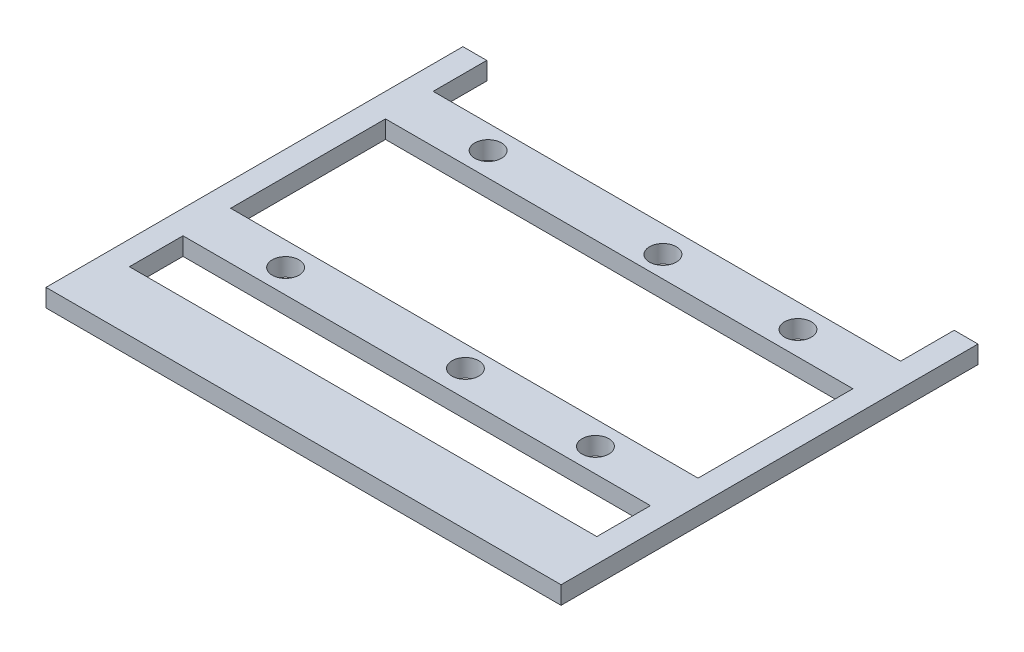
ISO-10303-21;
HEADER;
FILE_DESCRIPTION(('STEP AP214'),'2;1');
FILE_NAME('part.step','',(''),(''),'','','');
FILE_SCHEMA(('AUTOMOTIVE_DESIGN { 1 0 10303 214 1 1 1 1 }'));
ENDSEC;
DATA;
#1=APPLICATION_CONTEXT('core data for automotive mechanical design processes');
#2=APPLICATION_PROTOCOL_DEFINITION('international standard','automotive_design',2000,#1);
#3=PRODUCT_CONTEXT('',#1,'mechanical');
#4=PRODUCT('Part','Part','',(#3));
#5=PRODUCT_RELATED_PRODUCT_CATEGORY('part','',(#4));
#6=PRODUCT_DEFINITION_FORMATION('','',#4);
#7=PRODUCT_DEFINITION_CONTEXT('part definition',#1,'design');
#8=PRODUCT_DEFINITION('design','',#6,#7);
#9=PRODUCT_DEFINITION_SHAPE('','',#8);
#10=(LENGTH_UNIT() NAMED_UNIT(*) SI_UNIT(.MILLI.,.METRE.));
#11=(NAMED_UNIT(*) PLANE_ANGLE_UNIT() SI_UNIT($,.RADIAN.));
#12=(NAMED_UNIT(*) SI_UNIT($,.STERADIAN.) SOLID_ANGLE_UNIT());
#13=UNCERTAINTY_MEASURE_WITH_UNIT(LENGTH_MEASURE(1.E-05),#10,'distance_accuracy_value','');
#14=(GEOMETRIC_REPRESENTATION_CONTEXT(3) GLOBAL_UNCERTAINTY_ASSIGNED_CONTEXT((#13)) GLOBAL_UNIT_ASSIGNED_CONTEXT((#10,
#11,#12)) REPRESENTATION_CONTEXT('',''));
#15=CARTESIAN_POINT('',(0.,0.,0.));
#16=DIRECTION('',(0.,0.,1.));
#17=DIRECTION('',(1.,0.,0.));
#18=AXIS2_PLACEMENT_3D('',#15,#16,#17);
#19=CARTESIAN_POINT('',(0.,3.,0.));
#20=DIRECTION('',(0.,-1.,0.));
#21=DIRECTION('',(0.,0.,-1.));
#22=AXIS2_PLACEMENT_3D('',#19,#20,#21);
#23=PLANE('',#22);
#24=DIRECTION('',(-1.,0.,0.));
#25=VECTOR('',#24,1.);
#26=CARTESIAN_POINT('',(-43.2390670553936,3.,30.0000000000001));
#27=LINE('',#26,#25);
#28=CARTESIAN_POINT('',(39.2390670553936,3.,30.0000000000001));
#29=VERTEX_POINT('',#28);
#30=CARTESIAN_POINT('',(-39.2390670553936,3.,30.0000000000001));
#31=VERTEX_POINT('',#30);
#32=EDGE_CURVE('E193',#29,#31,#27,.T.);
#33=ORIENTED_EDGE('',*,*,#32,.T.);
#34=DIRECTION('',(0.,0.,-1.));
#35=VECTOR('',#34,1.);
#36=CARTESIAN_POINT('',(-39.2390670553936,3.,30.));
#37=LINE('',#36,#35);
#38=CARTESIAN_POINT('',(-39.2390670553936,3.,21.));
#39=VERTEX_POINT('',#38);
#40=EDGE_CURVE('E312',#31,#39,#37,.T.);
#41=ORIENTED_EDGE('',*,*,#40,.T.);
#42=DIRECTION('',(1.,0.,0.));
#43=VECTOR('',#42,1.);
#44=CARTESIAN_POINT('',(-39.2390670553936,3.,21.));
#45=LINE('',#44,#43);
#46=CARTESIAN_POINT('',(39.2390670553936,3.,21.));
#47=VERTEX_POINT('',#46);
#48=EDGE_CURVE('E315',#39,#47,#45,.T.);
#49=ORIENTED_EDGE('',*,*,#48,.T.);
#50=DIRECTION('',(0.,0.,1.));
#51=VECTOR('',#50,1.);
#52=CARTESIAN_POINT('',(39.2390670553936,3.,21.));
#53=LINE('',#52,#51);
#54=EDGE_CURVE('E318',#47,#29,#53,.T.);
#55=ORIENTED_EDGE('',*,*,#54,.T.);
#56=EDGE_LOOP('',(#33,#41,#49,#55));
#57=FACE_BOUND('',#56,.T.);
#58=DIRECTION('',(-1.,0.,0.));
#59=VECTOR('',#58,1.);
#60=CARTESIAN_POINT('',(39.2390670553936,3.,-30.));
#61=LINE('',#60,#59);
#62=CARTESIAN_POINT('',(43.2390670553936,3.,-30.));
#63=VERTEX_POINT('',#62);
#64=CARTESIAN_POINT('',(39.2390670553936,3.,-30.));
#65=VERTEX_POINT('',#64);
#66=EDGE_CURVE('E293',#63,#65,#61,.T.);
#67=ORIENTED_EDGE('',*,*,#66,.T.);
#68=DIRECTION('',(0.,0.,1.));
#69=VECTOR('',#68,1.);
#70=CARTESIAN_POINT('',(39.2390670553936,3.,-21.));
#71=LINE('',#70,#69);
#72=CARTESIAN_POINT('',(39.2390670553936,3.,-21.));
#73=VERTEX_POINT('',#72);
#74=EDGE_CURVE('E297',#65,#73,#71,.T.);
#75=ORIENTED_EDGE('',*,*,#74,.T.);
#76=DIRECTION('',(-1.,0.,0.));
#77=VECTOR('',#76,1.);
#78=CARTESIAN_POINT('',(-39.2390670553936,3.,-21.));
#79=LINE('',#78,#77);
#80=CARTESIAN_POINT('',(-39.2390670553936,3.,-21.));
#81=VERTEX_POINT('',#80);
#82=EDGE_CURVE('E300',#73,#81,#79,.T.);
#83=ORIENTED_EDGE('',*,*,#82,.T.);
#84=DIRECTION('',(0.,0.,-1.));
#85=VECTOR('',#84,1.);
#86=CARTESIAN_POINT('',(-39.2390670553936,3.,-30.));
#87=LINE('',#86,#85);
#88=CARTESIAN_POINT('',(-39.2390670553936,3.,-30.));
#89=VERTEX_POINT('',#88);
#90=EDGE_CURVE('E303',#81,#89,#87,.T.);
#91=ORIENTED_EDGE('',*,*,#90,.T.);
#92=DIRECTION('',(-1.,0.,0.));
#93=VECTOR('',#92,1.);
#94=CARTESIAN_POINT('',(-43.2390670553936,3.,-30.));
#95=LINE('',#94,#93);
#96=CARTESIAN_POINT('',(-43.2390670553936,3.,-30.));
#97=VERTEX_POINT('',#96);
#98=EDGE_CURVE('E306',#89,#97,#95,.T.);
#99=ORIENTED_EDGE('',*,*,#98,.T.);
#100=DIRECTION('',(0.,0.,1.));
#101=VECTOR('',#100,1.);
#102=CARTESIAN_POINT('',(-43.2390670553936,3.,30.));
#103=LINE('',#102,#101);
#104=CARTESIAN_POINT('',(-43.2390670553936,3.,40.0000000000001));
#105=VERTEX_POINT('',#104);
#106=EDGE_CURVE('E309',#97,#105,#103,.T.);
#107=ORIENTED_EDGE('',*,*,#106,.T.);
#108=DIRECTION('',(-1.,0.,0.));
#109=VECTOR('',#108,1.);
#110=CARTESIAN_POINT('',(-43.2390670553936,3.,40.0000000000001));
#111=LINE('',#110,#109);
#112=CARTESIAN_POINT('',(43.2390670553936,3.,40.0000000000001));
#113=VERTEX_POINT('',#112);
#114=EDGE_CURVE('E191',#113,#105,#111,.T.);
#115=ORIENTED_EDGE('',*,*,#114,.F.);
#116=DIRECTION('',(0.,0.,-1.));
#117=VECTOR('',#116,1.);
#118=CARTESIAN_POINT('',(43.2390670553936,3.,-30.));
#119=LINE('',#118,#117);
#120=EDGE_CURVE('E322',#113,#63,#119,.T.);
#121=ORIENTED_EDGE('',*,*,#120,.T.);
#122=EDGE_LOOP('',(#67,#75,#83,#91,#99,#107,#115,#121));
#123=FACE_BOUND('',#122,.T.);
#124=DIRECTION('',(-1.,0.,0.));
#125=VECTOR('',#124,1.);
#126=CARTESIAN_POINT('',(-39.2390670553936,3.,-13.));
#127=LINE('',#126,#125);
#128=CARTESIAN_POINT('',(39.2390670553936,3.,-13.));
#129=VERTEX_POINT('',#128);
#130=CARTESIAN_POINT('',(-39.2390670553936,3.,-13.));
#131=VERTEX_POINT('',#130);
#132=EDGE_CURVE('E255',#129,#131,#127,.T.);
#133=ORIENTED_EDGE('',*,*,#132,.F.);
#134=DIRECTION('',(0.,0.,-1.));
#135=VECTOR('',#134,1.);
#136=CARTESIAN_POINT('',(39.2390670553936,3.,-13.));
#137=LINE('',#136,#135);
#138=CARTESIAN_POINT('',(39.2390670553936,3.,13.));
#139=VERTEX_POINT('',#138);
#140=EDGE_CURVE('E265',#139,#129,#137,.T.);
#141=ORIENTED_EDGE('',*,*,#140,.F.);
#142=DIRECTION('',(1.,0.,0.));
#143=VECTOR('',#142,1.);
#144=CARTESIAN_POINT('',(-39.2390670553936,3.,13.));
#145=LINE('',#144,#143);
#146=CARTESIAN_POINT('',(-39.2390670553936,3.,13.));
#147=VERTEX_POINT('',#146);
#148=EDGE_CURVE('E262',#147,#139,#145,.T.);
#149=ORIENTED_EDGE('',*,*,#148,.F.);
#150=DIRECTION('',(0.,0.,1.));
#151=VECTOR('',#150,1.);
#152=CARTESIAN_POINT('',(-39.2390670553936,3.,13.));
#153=LINE('',#152,#151);
#154=EDGE_CURVE('E258',#131,#147,#153,.T.);
#155=ORIENTED_EDGE('',*,*,#154,.F.);
#156=EDGE_LOOP('',(#133,#141,#149,#155));
#157=FACE_BOUND('',#156,.T.);
#158=CARTESIAN_POINT('',(-26.0090670553936,3.,-17.));
#159=DIRECTION('',(0.,1.,0.));
#160=DIRECTION('',(0.,0.,1.));
#161=AXIS2_PLACEMENT_3D('',#158,#159,#160);
#162=CIRCLE('',#161,2.25);
#163=CARTESIAN_POINT('',(-26.0090670553936,3.,-14.75));
#164=VERTEX_POINT('',#163);
#165=EDGE_CURVE('E248',#164,#164,#162,.T.);
#166=ORIENTED_EDGE('',*,*,#165,.F.);
#167=EDGE_LOOP('',(#166));
#168=FACE_BOUND('',#167,.T.);
#169=CARTESIAN_POINT('',(3.76093294460641,3.,-16.5787630234036));
#170=DIRECTION('',(0.,1.,0.));
#171=DIRECTION('',(0.,0.,1.));
#172=AXIS2_PLACEMENT_3D('',#169,#170,#171);
#173=CIRCLE('',#172,2.25);
#174=CARTESIAN_POINT('',(3.76093294460641,3.,-14.3287630234036));
#175=VERTEX_POINT('',#174);
#176=EDGE_CURVE('E240',#175,#175,#173,.T.);
#177=ORIENTED_EDGE('',*,*,#176,.F.);
#178=EDGE_LOOP('',(#177));
#179=FACE_BOUND('',#178,.T.);
#180=CARTESIAN_POINT('',(26.0090670553936,3.,-17.));
#181=DIRECTION('',(0.,1.,0.));
#182=DIRECTION('',(0.,0.,1.));
#183=AXIS2_PLACEMENT_3D('',#180,#181,#182);
#184=CIRCLE('',#183,2.25);
#185=CARTESIAN_POINT('',(26.0090670553936,3.,-14.75));
#186=VERTEX_POINT('',#185);
#187=EDGE_CURVE('E232',#186,#186,#184,.T.);
#188=ORIENTED_EDGE('',*,*,#187,.F.);
#189=EDGE_LOOP('',(#188));
#190=FACE_BOUND('',#189,.T.);
#191=CARTESIAN_POINT('',(26.0090670553936,3.,17.));
#192=DIRECTION('',(0.,1.,0.));
#193=DIRECTION('',(0.,0.,-1.));
#194=AXIS2_PLACEMENT_3D('',#191,#192,#193);
#195=CIRCLE('',#194,2.25);
#196=CARTESIAN_POINT('',(26.0090670553936,3.,14.75));
#197=VERTEX_POINT('',#196);
#198=EDGE_CURVE('E224',#197,#197,#195,.T.);
#199=ORIENTED_EDGE('',*,*,#198,.F.);
#200=EDGE_LOOP('',(#199));
#201=FACE_BOUND('',#200,.T.);
#202=CARTESIAN_POINT('',(3.76093294460641,3.,16.5787630234036));
#203=DIRECTION('',(0.,1.,0.));
#204=DIRECTION('',(0.,0.,-1.));
#205=AXIS2_PLACEMENT_3D('',#202,#203,#204);
#206=CIRCLE('',#205,2.25);
#207=CARTESIAN_POINT('',(3.76093294460641,3.,14.3287630234036));
#208=VERTEX_POINT('',#207);
#209=EDGE_CURVE('E216',#208,#208,#206,.T.);
#210=ORIENTED_EDGE('',*,*,#209,.F.);
#211=EDGE_LOOP('',(#210));
#212=FACE_BOUND('',#211,.T.);
#213=CARTESIAN_POINT('',(-26.0090670553936,3.,17.));
#214=DIRECTION('',(0.,1.,0.));
#215=DIRECTION('',(0.,0.,-1.));
#216=AXIS2_PLACEMENT_3D('',#213,#214,#215);
#217=CIRCLE('',#216,2.25);
#218=CARTESIAN_POINT('',(-26.0090670553936,3.,14.75));
#219=VERTEX_POINT('',#218);
#220=EDGE_CURVE('E208',#219,#219,#217,.T.);
#221=ORIENTED_EDGE('',*,*,#220,.F.);
#222=EDGE_LOOP('',(#221));
#223=FACE_BOUND('',#222,.T.);
#224=ADVANCED_FACE('F45',(#57,#123,#157,#168,#179,#190,#201,#212,#223),#23,.F.);
#225=CARTESIAN_POINT('',(0.,0.,0.));
#226=DIRECTION('',(0.,-1.,0.));
#227=DIRECTION('',(0.,0.,-1.));
#228=AXIS2_PLACEMENT_3D('',#225,#226,#227);
#229=PLANE('',#228);
#230=DIRECTION('',(0.,0.,-1.));
#231=VECTOR('',#230,1.);
#232=CARTESIAN_POINT('',(-39.2390670553936,0.,30.));
#233=LINE('',#232,#231);
#234=CARTESIAN_POINT('',(-39.2390670553936,0.,30.));
#235=VERTEX_POINT('',#234);
#236=CARTESIAN_POINT('',(-39.2390670553936,0.,21.));
#237=VERTEX_POINT('',#236);
#238=EDGE_CURVE('E173',#235,#237,#233,.T.);
#239=ORIENTED_EDGE('',*,*,#238,.F.);
#240=DIRECTION('',(1.,0.,0.));
#241=VECTOR('',#240,1.);
#242=CARTESIAN_POINT('',(-43.2390670553936,0.,30.0000000000001));
#243=LINE('',#242,#241);
#244=CARTESIAN_POINT('',(39.2390670553936,0.,30.0000000000001));
#245=VERTEX_POINT('',#244);
#246=EDGE_CURVE('E197',#235,#245,#243,.T.);
#247=ORIENTED_EDGE('',*,*,#246,.T.);
#248=DIRECTION('',(0.,0.,1.));
#249=VECTOR('',#248,1.);
#250=CARTESIAN_POINT('',(39.2390670553936,0.,21.));
#251=LINE('',#250,#249);
#252=CARTESIAN_POINT('',(39.2390670553936,0.,21.));
#253=VERTEX_POINT('',#252);
#254=EDGE_CURVE('E345',#253,#245,#251,.T.);
#255=ORIENTED_EDGE('',*,*,#254,.F.);
#256=DIRECTION('',(1.,0.,0.));
#257=VECTOR('',#256,1.);
#258=CARTESIAN_POINT('',(-39.2390670553936,0.,21.));
#259=LINE('',#258,#257);
#260=EDGE_CURVE('E342',#237,#253,#259,.T.);
#261=ORIENTED_EDGE('',*,*,#260,.F.);
#262=EDGE_LOOP('',(#239,#247,#255,#261));
#263=FACE_BOUND('',#262,.T.);
#264=CARTESIAN_POINT('',(3.76093294460641,0.,16.5787630234036));
#265=DIRECTION('',(0.,1.,0.));
#266=DIRECTION('',(0.,0.,-1.));
#267=AXIS2_PLACEMENT_3D('',#264,#265,#266);
#268=CIRCLE('',#267,2.25);
#269=CARTESIAN_POINT('',(3.76093294460641,0.,14.3287630234036));
#270=VERTEX_POINT('',#269);
#271=EDGE_CURVE('E212',#270,#270,#268,.T.);
#272=ORIENTED_EDGE('',*,*,#271,.T.);
#273=EDGE_LOOP('',(#272));
#274=FACE_BOUND('',#273,.T.);
#275=CARTESIAN_POINT('',(26.0090670553936,0.,-17.));
#276=DIRECTION('',(0.,1.,0.));
#277=DIRECTION('',(0.,0.,1.));
#278=AXIS2_PLACEMENT_3D('',#275,#276,#277);
#279=CIRCLE('',#278,2.25);
#280=CARTESIAN_POINT('',(26.0090670553936,0.,-14.75));
#281=VERTEX_POINT('',#280);
#282=EDGE_CURVE('E228',#281,#281,#279,.T.);
#283=ORIENTED_EDGE('',*,*,#282,.T.);
#284=EDGE_LOOP('',(#283));
#285=FACE_BOUND('',#284,.T.);
#286=CARTESIAN_POINT('',(-26.0090670553936,0.,-17.));
#287=DIRECTION('',(0.,1.,0.));
#288=DIRECTION('',(0.,0.,1.));
#289=AXIS2_PLACEMENT_3D('',#286,#287,#288);
#290=CIRCLE('',#289,2.25);
#291=CARTESIAN_POINT('',(-26.0090670553936,0.,-14.75));
#292=VERTEX_POINT('',#291);
#293=EDGE_CURVE('E244',#292,#292,#290,.T.);
#294=ORIENTED_EDGE('',*,*,#293,.T.);
#295=EDGE_LOOP('',(#294));
#296=FACE_BOUND('',#295,.T.);
#297=DIRECTION('',(-1.,0.,0.));
#298=VECTOR('',#297,1.);
#299=CARTESIAN_POINT('',(39.2390670553936,0.,-30.));
#300=LINE('',#299,#298);
#301=CARTESIAN_POINT('',(43.2390670553936,0.,-30.));
#302=VERTEX_POINT('',#301);
#303=CARTESIAN_POINT('',(39.2390670553936,0.,-30.));
#304=VERTEX_POINT('',#303);
#305=EDGE_CURVE('E292',#302,#304,#300,.T.);
#306=ORIENTED_EDGE('',*,*,#305,.F.);
#307=DIRECTION('',(0.,0.,-1.));
#308=VECTOR('',#307,1.);
#309=CARTESIAN_POINT('',(43.2390670553936,0.,-30.));
#310=LINE('',#309,#308);
#311=CARTESIAN_POINT('',(43.2390670553936,0.,40.0000000000001));
#312=VERTEX_POINT('',#311);
#313=EDGE_CURVE('E181',#312,#302,#310,.T.);
#314=ORIENTED_EDGE('',*,*,#313,.F.);
#315=DIRECTION('',(1.,0.,0.));
#316=VECTOR('',#315,1.);
#317=CARTESIAN_POINT('',(-43.2390670553936,0.,40.0000000000001));
#318=LINE('',#317,#316);
#319=CARTESIAN_POINT('',(-43.2390670553936,0.,40.0000000000001));
#320=VERTEX_POINT('',#319);
#321=EDGE_CURVE('E177',#320,#312,#318,.T.);
#322=ORIENTED_EDGE('',*,*,#321,.F.);
#323=DIRECTION('',(0.,0.,1.));
#324=VECTOR('',#323,1.);
#325=CARTESIAN_POINT('',(-43.2390670553936,0.,30.));
#326=LINE('',#325,#324);
#327=CARTESIAN_POINT('',(-43.2390670553936,0.,-30.));
#328=VERTEX_POINT('',#327);
#329=EDGE_CURVE('E162',#328,#320,#326,.T.);
#330=ORIENTED_EDGE('',*,*,#329,.F.);
#331=DIRECTION('',(-1.,0.,0.));
#332=VECTOR('',#331,1.);
#333=CARTESIAN_POINT('',(-43.2390670553936,0.,-30.));
#334=LINE('',#333,#332);
#335=CARTESIAN_POINT('',(-39.2390670553936,0.,-30.));
#336=VERTEX_POINT('',#335);
#337=EDGE_CURVE('E174',#336,#328,#334,.T.);
#338=ORIENTED_EDGE('',*,*,#337,.F.);
#339=DIRECTION('',(0.,0.,-1.));
#340=VECTOR('',#339,1.);
#341=CARTESIAN_POINT('',(-39.2390670553936,0.,-30.));
#342=LINE('',#341,#340);
#343=CARTESIAN_POINT('',(-39.2390670553936,0.,-21.));
#344=VERTEX_POINT('',#343);
#345=EDGE_CURVE('E335',#344,#336,#342,.T.);
#346=ORIENTED_EDGE('',*,*,#345,.F.);
#347=DIRECTION('',(-1.,0.,0.));
#348=VECTOR('',#347,1.);
#349=CARTESIAN_POINT('',(-39.2390670553936,0.,-21.));
#350=LINE('',#349,#348);
#351=CARTESIAN_POINT('',(39.2390670553936,0.,-21.));
#352=VERTEX_POINT('',#351);
#353=EDGE_CURVE('E332',#352,#344,#350,.T.);
#354=ORIENTED_EDGE('',*,*,#353,.F.);
#355=DIRECTION('',(0.,0.,1.));
#356=VECTOR('',#355,1.);
#357=CARTESIAN_POINT('',(39.2390670553936,0.,-21.));
#358=LINE('',#357,#356);
#359=EDGE_CURVE('E329',#304,#352,#358,.T.);
#360=ORIENTED_EDGE('',*,*,#359,.F.);
#361=EDGE_LOOP('',(#306,#314,#322,#330,#338,#346,#354,#360));
#362=FACE_BOUND('',#361,.T.);
#363=DIRECTION('',(0.,0.,-1.));
#364=VECTOR('',#363,1.);
#365=CARTESIAN_POINT('',(39.2390670553936,0.,-13.));
#366=LINE('',#365,#364);
#367=CARTESIAN_POINT('',(39.2390670553936,0.,13.));
#368=VERTEX_POINT('',#367);
#369=CARTESIAN_POINT('',(39.2390670553936,0.,-13.));
#370=VERTEX_POINT('',#369);
#371=EDGE_CURVE('E259',#368,#370,#366,.T.);
#372=ORIENTED_EDGE('',*,*,#371,.T.);
#373=DIRECTION('',(-1.,0.,0.));
#374=VECTOR('',#373,1.);
#375=CARTESIAN_POINT('',(-39.2390670553936,0.,-13.));
#376=LINE('',#375,#374);
#377=CARTESIAN_POINT('',(-39.2390670553936,0.,-13.));
#378=VERTEX_POINT('',#377);
#379=EDGE_CURVE('E69',#370,#378,#376,.T.);
#380=ORIENTED_EDGE('',*,*,#379,.T.);
#381=DIRECTION('',(0.,0.,1.));
#382=VECTOR('',#381,1.);
#383=CARTESIAN_POINT('',(-39.2390670553936,0.,13.));
#384=LINE('',#383,#382);
#385=CARTESIAN_POINT('',(-39.2390670553936,0.,13.));
#386=VERTEX_POINT('',#385);
#387=EDGE_CURVE('E271',#378,#386,#384,.T.);
#388=ORIENTED_EDGE('',*,*,#387,.T.);
#389=DIRECTION('',(1.,0.,0.));
#390=VECTOR('',#389,1.);
#391=CARTESIAN_POINT('',(-39.2390670553936,0.,13.));
#392=LINE('',#391,#390);
#393=EDGE_CURVE('E275',#386,#368,#392,.T.);
#394=ORIENTED_EDGE('',*,*,#393,.T.);
#395=EDGE_LOOP('',(#372,#380,#388,#394));
#396=FACE_BOUND('',#395,.T.);
#397=CARTESIAN_POINT('',(3.76093294460641,0.,-16.5787630234036));
#398=DIRECTION('',(0.,1.,0.));
#399=DIRECTION('',(0.,0.,1.));
#400=AXIS2_PLACEMENT_3D('',#397,#398,#399);
#401=CIRCLE('',#400,2.25);
#402=CARTESIAN_POINT('',(3.76093294460641,0.,-14.3287630234036));
#403=VERTEX_POINT('',#402);
#404=EDGE_CURVE('E236',#403,#403,#401,.T.);
#405=ORIENTED_EDGE('',*,*,#404,.T.);
#406=EDGE_LOOP('',(#405));
#407=FACE_BOUND('',#406,.T.);
#408=CARTESIAN_POINT('',(26.0090670553936,0.,17.));
#409=DIRECTION('',(0.,1.,0.));
#410=DIRECTION('',(0.,0.,-1.));
#411=AXIS2_PLACEMENT_3D('',#408,#409,#410);
#412=CIRCLE('',#411,2.25);
#413=CARTESIAN_POINT('',(26.0090670553936,0.,14.75));
#414=VERTEX_POINT('',#413);
#415=EDGE_CURVE('E220',#414,#414,#412,.T.);
#416=ORIENTED_EDGE('',*,*,#415,.T.);
#417=EDGE_LOOP('',(#416));
#418=FACE_BOUND('',#417,.T.);
#419=CARTESIAN_POINT('',(-26.0090670553936,0.,17.));
#420=DIRECTION('',(0.,1.,0.));
#421=DIRECTION('',(0.,0.,-1.));
#422=AXIS2_PLACEMENT_3D('',#419,#420,#421);
#423=CIRCLE('',#422,2.25);
#424=CARTESIAN_POINT('',(-26.0090670553936,0.,14.75));
#425=VERTEX_POINT('',#424);
#426=EDGE_CURVE('E204',#425,#425,#423,.T.);
#427=ORIENTED_EDGE('',*,*,#426,.T.);
#428=EDGE_LOOP('',(#427));
#429=FACE_BOUND('',#428,.T.);
#430=ADVANCED_FACE('F179',(#263,#274,#285,#296,#362,#396,#407,#418,#429),#229,.T.);
#431=CARTESIAN_POINT('',(39.2390670553936,3.,-30.));
#432=DIRECTION('',(0.,0.,1.));
#433=DIRECTION('',(1.,0.,0.));
#434=AXIS2_PLACEMENT_3D('',#431,#432,#433);
#435=PLANE('',#434);
#436=ORIENTED_EDGE('',*,*,#305,.T.);
#437=DIRECTION('',(0.,-1.,0.));
#438=VECTOR('',#437,1.);
#439=CARTESIAN_POINT('',(39.2390670553936,3.,-30.));
#440=LINE('',#439,#438);
#441=EDGE_CURVE('E11',#65,#304,#440,.T.);
#442=ORIENTED_EDGE('',*,*,#441,.F.);
#443=ORIENTED_EDGE('',*,*,#66,.F.);
#444=DIRECTION('',(0.,-1.,0.));
#445=VECTOR('',#444,1.);
#446=CARTESIAN_POINT('',(43.2390670553936,3.,-30.));
#447=LINE('',#446,#445);
#448=EDGE_CURVE('E325',#63,#302,#447,.T.);
#449=ORIENTED_EDGE('',*,*,#448,.T.);
#450=EDGE_LOOP('',(#436,#442,#443,#449));
#451=FACE_BOUND('',#450,.T.);
#452=ADVANCED_FACE('F47',(#451),#435,.F.);
#453=CARTESIAN_POINT('',(39.2390670553936,3.,-21.));
#454=DIRECTION('',(1.,0.,0.));
#455=DIRECTION('',(0.,0.,-1.));
#456=AXIS2_PLACEMENT_3D('',#453,#454,#455);
#457=PLANE('',#456);
#458=ORIENTED_EDGE('',*,*,#359,.T.);
#459=DIRECTION('',(0.,-1.,0.));
#460=VECTOR('',#459,1.);
#461=CARTESIAN_POINT('',(39.2390670553936,3.,-21.));
#462=LINE('',#461,#460);
#463=EDGE_CURVE('E54',#73,#352,#462,.T.);
#464=ORIENTED_EDGE('',*,*,#463,.F.);
#465=ORIENTED_EDGE('',*,*,#74,.F.);
#466=ORIENTED_EDGE('',*,*,#441,.T.);
#467=EDGE_LOOP('',(#458,#464,#465,#466));
#468=FACE_BOUND('',#467,.T.);
#469=ADVANCED_FACE('F399',(#468),#457,.F.);
#470=CARTESIAN_POINT('',(-39.2390670553936,3.,-21.));
#471=DIRECTION('',(0.,0.,1.));
#472=DIRECTION('',(1.,0.,0.));
#473=AXIS2_PLACEMENT_3D('',#470,#471,#472);
#474=PLANE('',#473);
#475=ORIENTED_EDGE('',*,*,#353,.T.);
#476=DIRECTION('',(0.,-1.,0.));
#477=VECTOR('',#476,1.);
#478=CARTESIAN_POINT('',(-39.2390670553936,3.,-21.));
#479=LINE('',#478,#477);
#480=EDGE_CURVE('E375',#81,#344,#479,.T.);
#481=ORIENTED_EDGE('',*,*,#480,.F.);
#482=ORIENTED_EDGE('',*,*,#82,.F.);
#483=ORIENTED_EDGE('',*,*,#463,.T.);
#484=EDGE_LOOP('',(#475,#481,#482,#483));
#485=FACE_BOUND('',#484,.T.);
#486=ADVANCED_FACE('F384',(#485),#474,.F.);
#487=CARTESIAN_POINT('',(-39.2390670553936,3.,-30.));
#488=DIRECTION('',(-1.,0.,0.));
#489=DIRECTION('',(0.,0.,1.));
#490=AXIS2_PLACEMENT_3D('',#487,#488,#489);
#491=PLANE('',#490);
#492=ORIENTED_EDGE('',*,*,#345,.T.);
#493=DIRECTION('',(0.,-1.,0.));
#494=VECTOR('',#493,1.);
#495=CARTESIAN_POINT('',(-39.2390670553936,3.,-30.));
#496=LINE('',#495,#494);
#497=EDGE_CURVE('E371',#89,#336,#496,.T.);
#498=ORIENTED_EDGE('',*,*,#497,.F.);
#499=ORIENTED_EDGE('',*,*,#90,.F.);
#500=ORIENTED_EDGE('',*,*,#480,.T.);
#501=EDGE_LOOP('',(#492,#498,#499,#500));
#502=FACE_BOUND('',#501,.T.);
#503=ADVANCED_FACE('F390',(#502),#491,.F.);
#504=CARTESIAN_POINT('',(-43.2390670553936,3.,-30.));
#505=DIRECTION('',(0.,0.,1.));
#506=DIRECTION('',(1.,0.,0.));
#507=AXIS2_PLACEMENT_3D('',#504,#505,#506);
#508=PLANE('',#507);
#509=ORIENTED_EDGE('',*,*,#337,.T.);
#510=DIRECTION('',(0.,-1.,0.));
#511=VECTOR('',#510,1.);
#512=CARTESIAN_POINT('',(-43.2390670553936,3.,-30.));
#513=LINE('',#512,#511);
#514=EDGE_CURVE('E169',#97,#328,#513,.T.);
#515=ORIENTED_EDGE('',*,*,#514,.F.);
#516=ORIENTED_EDGE('',*,*,#98,.F.);
#517=ORIENTED_EDGE('',*,*,#497,.T.);
#518=EDGE_LOOP('',(#509,#515,#516,#517));
#519=FACE_BOUND('',#518,.T.);
#520=ADVANCED_FACE('F394',(#519),#508,.F.);
#521=CARTESIAN_POINT('',(-43.2390670553936,3.,30.));
#522=DIRECTION('',(1.,0.,0.));
#523=DIRECTION('',(0.,0.,-1.));
#524=AXIS2_PLACEMENT_3D('',#521,#522,#523);
#525=PLANE('',#524);
#526=ORIENTED_EDGE('',*,*,#329,.T.);
#527=DIRECTION('',(0.,-1.,0.));
#528=VECTOR('',#527,1.);
#529=CARTESIAN_POINT('',(-43.2390670553936,0.,40.0000000000001));
#530=LINE('',#529,#528);
#531=EDGE_CURVE('E167',#105,#320,#530,.T.);
#532=ORIENTED_EDGE('',*,*,#531,.F.);
#533=ORIENTED_EDGE('',*,*,#106,.F.);
#534=ORIENTED_EDGE('',*,*,#514,.T.);
#535=EDGE_LOOP('',(#526,#532,#533,#534));
#536=FACE_BOUND('',#535,.T.);
#537=ADVANCED_FACE('F164',(#536),#525,.F.);
#538=CARTESIAN_POINT('',(-39.2390670553936,3.,30.));
#539=DIRECTION('',(-1.,0.,0.));
#540=DIRECTION('',(0.,0.,1.));
#541=AXIS2_PLACEMENT_3D('',#538,#539,#540);
#542=PLANE('',#541);
#543=ORIENTED_EDGE('',*,*,#238,.T.);
#544=DIRECTION('',(0.,-1.,0.));
#545=VECTOR('',#544,1.);
#546=CARTESIAN_POINT('',(-39.2390670553936,3.,21.));
#547=LINE('',#546,#545);
#548=EDGE_CURVE('E361',#39,#237,#547,.T.);
#549=ORIENTED_EDGE('',*,*,#548,.F.);
#550=ORIENTED_EDGE('',*,*,#40,.F.);
#551=DIRECTION('',(0.,-1.,0.));
#552=VECTOR('',#551,1.);
#553=CARTESIAN_POINT('',(-39.2390670553936,3.,30.));
#554=LINE('',#553,#552);
#555=EDGE_CURVE('E365',#31,#235,#554,.T.);
#556=ORIENTED_EDGE('',*,*,#555,.T.);
#557=EDGE_LOOP('',(#543,#549,#550,#556));
#558=FACE_BOUND('',#557,.T.);
#559=ADVANCED_FACE('F491',(#558),#542,.F.);
#560=CARTESIAN_POINT('',(-39.2390670553936,3.,21.));
#561=DIRECTION('',(0.,0.,-1.));
#562=DIRECTION('',(-1.,0.,0.));
#563=AXIS2_PLACEMENT_3D('',#560,#561,#562);
#564=PLANE('',#563);
#565=ORIENTED_EDGE('',*,*,#260,.T.);
#566=DIRECTION('',(0.,-1.,0.));
#567=VECTOR('',#566,1.);
#568=CARTESIAN_POINT('',(39.2390670553936,3.,21.));
#569=LINE('',#568,#567);
#570=EDGE_CURVE('E357',#47,#253,#569,.T.);
#571=ORIENTED_EDGE('',*,*,#570,.F.);
#572=ORIENTED_EDGE('',*,*,#48,.F.);
#573=ORIENTED_EDGE('',*,*,#548,.T.);
#574=EDGE_LOOP('',(#565,#571,#572,#573));
#575=FACE_BOUND('',#574,.T.);
#576=ADVANCED_FACE('F415',(#575),#564,.F.);
#577=CARTESIAN_POINT('',(39.2390670553936,3.,21.));
#578=DIRECTION('',(1.,0.,0.));
#579=DIRECTION('',(0.,0.,-1.));
#580=AXIS2_PLACEMENT_3D('',#577,#578,#579);
#581=PLANE('',#580);
#582=ORIENTED_EDGE('',*,*,#254,.T.);
#583=DIRECTION('',(0.,-1.,0.));
#584=VECTOR('',#583,1.);
#585=CARTESIAN_POINT('',(39.2390670553936,3.,30.));
#586=LINE('',#585,#584);
#587=EDGE_CURVE('E354',#29,#245,#586,.T.);
#588=ORIENTED_EDGE('',*,*,#587,.F.);
#589=ORIENTED_EDGE('',*,*,#54,.F.);
#590=ORIENTED_EDGE('',*,*,#570,.T.);
#591=EDGE_LOOP('',(#582,#588,#589,#590));
#592=FACE_BOUND('',#591,.T.);
#593=ADVANCED_FACE('F406',(#592),#581,.F.);
#594=CARTESIAN_POINT('',(43.2390670553936,3.,-30.));
#595=DIRECTION('',(-1.,0.,0.));
#596=DIRECTION('',(0.,0.,1.));
#597=AXIS2_PLACEMENT_3D('',#594,#595,#596);
#598=PLANE('',#597);
#599=ORIENTED_EDGE('',*,*,#313,.T.);
#600=ORIENTED_EDGE('',*,*,#448,.F.);
#601=ORIENTED_EDGE('',*,*,#120,.F.);
#602=DIRECTION('',(0.,1.,0.));
#603=VECTOR('',#602,1.);
#604=CARTESIAN_POINT('',(43.2390670553936,0.,40.0000000000001));
#605=LINE('',#604,#603);
#606=EDGE_CURVE('E186',#312,#113,#605,.T.);
#607=ORIENTED_EDGE('',*,*,#606,.F.);
#608=EDGE_LOOP('',(#599,#600,#601,#607));
#609=FACE_BOUND('',#608,.T.);
#610=ADVANCED_FACE('F403',(#609),#598,.F.);
#611=CARTESIAN_POINT('',(-39.2390670553936,3.,-13.));
#612=DIRECTION('',(0.,0.,1.));
#613=DIRECTION('',(1.,0.,0.));
#614=AXIS2_PLACEMENT_3D('',#611,#612,#613);
#615=PLANE('',#614);
#616=ORIENTED_EDGE('',*,*,#379,.F.);
#617=DIRECTION('',(0.,-1.,0.));
#618=VECTOR('',#617,1.);
#619=CARTESIAN_POINT('',(39.2390670553936,3.,-13.));
#620=LINE('',#619,#618);
#621=EDGE_CURVE('E268',#129,#370,#620,.T.);
#622=ORIENTED_EDGE('',*,*,#621,.F.);
#623=ORIENTED_EDGE('',*,*,#132,.T.);
#624=DIRECTION('',(0.,-1.,0.));
#625=VECTOR('',#624,1.);
#626=CARTESIAN_POINT('',(-39.2390670553936,3.,-13.));
#627=LINE('',#626,#625);
#628=EDGE_CURVE('E289',#131,#378,#627,.T.);
#629=ORIENTED_EDGE('',*,*,#628,.T.);
#630=EDGE_LOOP('',(#616,#622,#623,#629));
#631=FACE_BOUND('',#630,.T.);
#632=ADVANCED_FACE('F405',(#631),#615,.T.);
#633=CARTESIAN_POINT('',(-39.2390670553936,3.,13.));
#634=DIRECTION('',(1.,0.,0.));
#635=DIRECTION('',(0.,0.,-1.));
#636=AXIS2_PLACEMENT_3D('',#633,#634,#635);
#637=PLANE('',#636);
#638=ORIENTED_EDGE('',*,*,#387,.F.);
#639=ORIENTED_EDGE('',*,*,#628,.F.);
#640=ORIENTED_EDGE('',*,*,#154,.T.);
#641=DIRECTION('',(0.,-1.,0.));
#642=VECTOR('',#641,1.);
#643=CARTESIAN_POINT('',(-39.2390670553936,3.,13.));
#644=LINE('',#643,#642);
#645=EDGE_CURVE('E286',#147,#386,#644,.T.);
#646=ORIENTED_EDGE('',*,*,#645,.T.);
#647=EDGE_LOOP('',(#638,#639,#640,#646));
#648=FACE_BOUND('',#647,.T.);
#649=ADVANCED_FACE('F413',(#648),#637,.T.);
#650=CARTESIAN_POINT('',(-39.2390670553936,3.,13.));
#651=DIRECTION('',(0.,0.,-1.));
#652=DIRECTION('',(-1.,0.,0.));
#653=AXIS2_PLACEMENT_3D('',#650,#651,#652);
#654=PLANE('',#653);
#655=ORIENTED_EDGE('',*,*,#393,.F.);
#656=ORIENTED_EDGE('',*,*,#645,.F.);
#657=ORIENTED_EDGE('',*,*,#148,.T.);
#658=DIRECTION('',(0.,-1.,0.));
#659=VECTOR('',#658,1.);
#660=CARTESIAN_POINT('',(39.2390670553936,3.,13.));
#661=LINE('',#660,#659);
#662=EDGE_CURVE('E61',#139,#368,#661,.T.);
#663=ORIENTED_EDGE('',*,*,#662,.T.);
#664=EDGE_LOOP('',(#655,#656,#657,#663));
#665=FACE_BOUND('',#664,.T.);
#666=ADVANCED_FACE('F430',(#665),#654,.T.);
#667=CARTESIAN_POINT('',(39.2390670553936,3.,-13.));
#668=DIRECTION('',(-1.,0.,0.));
#669=DIRECTION('',(0.,0.,1.));
#670=AXIS2_PLACEMENT_3D('',#667,#668,#669);
#671=PLANE('',#670);
#672=ORIENTED_EDGE('',*,*,#371,.F.);
#673=ORIENTED_EDGE('',*,*,#662,.F.);
#674=ORIENTED_EDGE('',*,*,#140,.T.);
#675=ORIENTED_EDGE('',*,*,#621,.T.);
#676=EDGE_LOOP('',(#672,#673,#674,#675));
#677=FACE_BOUND('',#676,.T.);
#678=ADVANCED_FACE('F434',(#677),#671,.T.);
#679=CARTESIAN_POINT('',(-26.0090670553936,3.,-17.));
#680=DIRECTION('',(0.,-1.,0.));
#681=DIRECTION('',(0.,0.,-1.));
#682=AXIS2_PLACEMENT_3D('',#679,#680,#681);
#683=CYLINDRICAL_SURFACE('',#682,2.25);
#684=ORIENTED_EDGE('',*,*,#165,.T.);
#685=EDGE_LOOP('',(#684));
#686=FACE_BOUND('',#685,.T.);
#687=ORIENTED_EDGE('',*,*,#293,.F.);
#688=EDGE_LOOP('',(#687));
#689=FACE_BOUND('',#688,.T.);
#690=ADVANCED_FACE('F438',(#686,#689),#683,.F.);
#691=CARTESIAN_POINT('',(3.76093294460641,3.,-16.5787630234036));
#692=DIRECTION('',(0.,-1.,0.));
#693=DIRECTION('',(0.,0.,-1.));
#694=AXIS2_PLACEMENT_3D('',#691,#692,#693);
#695=CYLINDRICAL_SURFACE('',#694,2.25);
#696=ORIENTED_EDGE('',*,*,#176,.T.);
#697=EDGE_LOOP('',(#696));
#698=FACE_BOUND('',#697,.T.);
#699=ORIENTED_EDGE('',*,*,#404,.F.);
#700=EDGE_LOOP('',(#699));
#701=FACE_BOUND('',#700,.T.);
#702=ADVANCED_FACE('F441',(#698,#701),#695,.F.);
#703=CARTESIAN_POINT('',(26.0090670553936,3.,-17.));
#704=DIRECTION('',(0.,-1.,0.));
#705=DIRECTION('',(0.,0.,-1.));
#706=AXIS2_PLACEMENT_3D('',#703,#704,#705);
#707=CYLINDRICAL_SURFACE('',#706,2.25);
#708=ORIENTED_EDGE('',*,*,#187,.T.);
#709=EDGE_LOOP('',(#708));
#710=FACE_BOUND('',#709,.T.);
#711=ORIENTED_EDGE('',*,*,#282,.F.);
#712=EDGE_LOOP('',(#711));
#713=FACE_BOUND('',#712,.T.);
#714=ADVANCED_FACE('F445',(#710,#713),#707,.F.);
#715=CARTESIAN_POINT('',(26.0090670553936,3.,17.));
#716=DIRECTION('',(0.,-1.,0.));
#717=DIRECTION('',(0.,0.,-1.));
#718=AXIS2_PLACEMENT_3D('',#715,#716,#717);
#719=CYLINDRICAL_SURFACE('',#718,2.25);
#720=ORIENTED_EDGE('',*,*,#198,.T.);
#721=EDGE_LOOP('',(#720));
#722=FACE_BOUND('',#721,.T.);
#723=ORIENTED_EDGE('',*,*,#415,.F.);
#724=EDGE_LOOP('',(#723));
#725=FACE_BOUND('',#724,.T.);
#726=ADVANCED_FACE('F449',(#722,#725),#719,.F.);
#727=CARTESIAN_POINT('',(3.76093294460641,3.,16.5787630234036));
#728=DIRECTION('',(0.,-1.,0.));
#729=DIRECTION('',(0.,0.,-1.));
#730=AXIS2_PLACEMENT_3D('',#727,#728,#729);
#731=CYLINDRICAL_SURFACE('',#730,2.25);
#732=ORIENTED_EDGE('',*,*,#209,.T.);
#733=EDGE_LOOP('',(#732));
#734=FACE_BOUND('',#733,.T.);
#735=ORIENTED_EDGE('',*,*,#271,.F.);
#736=EDGE_LOOP('',(#735));
#737=FACE_BOUND('',#736,.T.);
#738=ADVANCED_FACE('F453',(#734,#737),#731,.F.);
#739=CARTESIAN_POINT('',(-26.0090670553936,3.,17.));
#740=DIRECTION('',(0.,-1.,0.));
#741=DIRECTION('',(0.,0.,-1.));
#742=AXIS2_PLACEMENT_3D('',#739,#740,#741);
#743=CYLINDRICAL_SURFACE('',#742,2.25);
#744=ORIENTED_EDGE('',*,*,#220,.T.);
#745=EDGE_LOOP('',(#744));
#746=FACE_BOUND('',#745,.T.);
#747=ORIENTED_EDGE('',*,*,#426,.F.);
#748=EDGE_LOOP('',(#747));
#749=FACE_BOUND('',#748,.T.);
#750=ADVANCED_FACE('F457',(#746,#749),#743,.F.);
#751=CARTESIAN_POINT('',(0.,0.,30.0000000000001));
#752=DIRECTION('',(0.,0.,-1.));
#753=DIRECTION('',(-1.,0.,0.));
#754=AXIS2_PLACEMENT_3D('',#751,#752,#753);
#755=PLANE('',#754);
#756=ORIENTED_EDGE('',*,*,#555,.F.);
#757=ORIENTED_EDGE('',*,*,#32,.F.);
#758=ORIENTED_EDGE('',*,*,#587,.T.);
#759=ORIENTED_EDGE('',*,*,#246,.F.);
#760=EDGE_LOOP('',(#756,#757,#758,#759));
#761=FACE_BOUND('',#760,.T.);
#762=ADVANCED_FACE('F460',(#761),#755,.T.);
#763=CARTESIAN_POINT('',(0.,0.,40.0000000000001));
#764=DIRECTION('',(0.,0.,-1.));
#765=DIRECTION('',(-1.,0.,0.));
#766=AXIS2_PLACEMENT_3D('',#763,#764,#765);
#767=PLANE('',#766);
#768=ORIENTED_EDGE('',*,*,#531,.T.);
#769=ORIENTED_EDGE('',*,*,#321,.T.);
#770=ORIENTED_EDGE('',*,*,#606,.T.);
#771=ORIENTED_EDGE('',*,*,#114,.T.);
#772=EDGE_LOOP('',(#768,#769,#770,#771));
#773=FACE_BOUND('',#772,.T.);
#774=ADVANCED_FACE('F189',(#773),#767,.F.);
#775=CLOSED_SHELL('',(#224,#430,#452,#469,#486,#503,#520,#537,#559,#576,#593,#610,#632,#649,
#666,#678,#690,#702,#714,#726,#738,#750,#762,#774));
#776=MANIFOLD_SOLID_BREP('B2',#775);
#777=ADVANCED_BREP_SHAPE_REPRESENTATION('',(#18,#776),#14);
#778=SHAPE_DEFINITION_REPRESENTATION(#9,#777);
ENDSEC;
END-ISO-10303-21;
